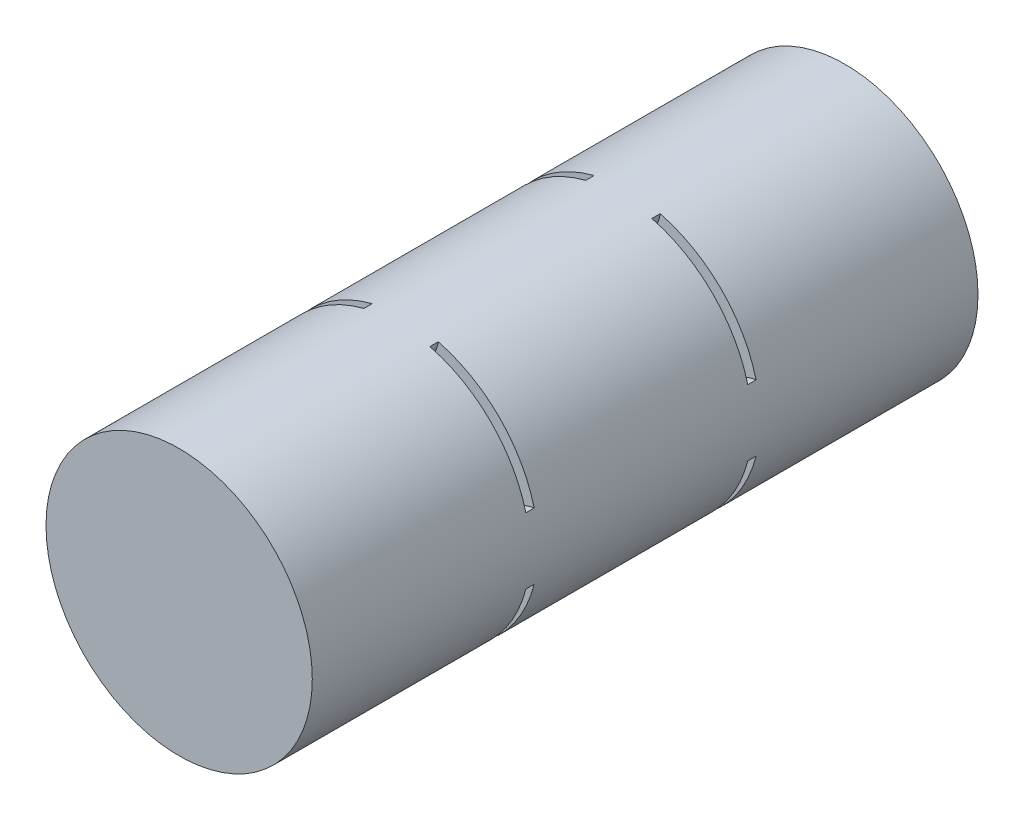
ISO-10303-21;
HEADER;
FILE_DESCRIPTION(('STEP AP214'),'2;1');
FILE_NAME('part.step','',(''),(''),'','','');
FILE_SCHEMA(('AUTOMOTIVE_DESIGN { 1 0 10303 214 1 1 1 1 }'));
ENDSEC;
DATA;
#1=APPLICATION_CONTEXT('core data for automotive mechanical design processes');
#2=APPLICATION_PROTOCOL_DEFINITION('international standard','automotive_design',2000,#1);
#3=PRODUCT_CONTEXT('',#1,'mechanical');
#4=PRODUCT('Part','Part','',(#3));
#5=PRODUCT_RELATED_PRODUCT_CATEGORY('part','',(#4));
#6=PRODUCT_DEFINITION_FORMATION('','',#4);
#7=PRODUCT_DEFINITION_CONTEXT('part definition',#1,'design');
#8=PRODUCT_DEFINITION('design','',#6,#7);
#9=PRODUCT_DEFINITION_SHAPE('','',#8);
#10=(LENGTH_UNIT() NAMED_UNIT(*) SI_UNIT(.MILLI.,.METRE.));
#11=(NAMED_UNIT(*) PLANE_ANGLE_UNIT() SI_UNIT($,.RADIAN.));
#12=(NAMED_UNIT(*) SI_UNIT($,.STERADIAN.) SOLID_ANGLE_UNIT());
#13=UNCERTAINTY_MEASURE_WITH_UNIT(LENGTH_MEASURE(1.E-05),#10,'distance_accuracy_value','');
#14=(GEOMETRIC_REPRESENTATION_CONTEXT(3) GLOBAL_UNCERTAINTY_ASSIGNED_CONTEXT((#13)) GLOBAL_UNIT_ASSIGNED_CONTEXT((#10,
#11,#12)) REPRESENTATION_CONTEXT('',''));
#15=CARTESIAN_POINT('',(0.,0.,0.));
#16=DIRECTION('',(0.,0.,1.));
#17=DIRECTION('',(1.,0.,0.));
#18=AXIS2_PLACEMENT_3D('',#15,#16,#17);
#19=CARTESIAN_POINT('',(0.,0.,254.));
#20=DIRECTION('',(0.,0.,-1.));
#21=DIRECTION('',(-1.,0.,0.));
#22=AXIS2_PLACEMENT_3D('',#19,#20,#21);
#23=CYLINDRICAL_SURFACE('',#22,50.8);
#24=DIRECTION('',(0.,0.,-1.));
#25=VECTOR('',#24,1.);
#26=CARTESIAN_POINT('',(-49.2125000000001,-12.6003906189445,86.25332));
#27=LINE('',#26,#25);
#28=CARTESIAN_POINT('',(-49.2125000000001,-12.6003906189445,86.25332));
#29=VERTEX_POINT('',#28);
#30=CARTESIAN_POINT('',(-49.2125000000001,-12.6003906189445,83.07832));
#31=VERTEX_POINT('',#30);
#32=EDGE_CURVE('E191',#29,#31,#27,.T.);
#33=ORIENTED_EDGE('',*,*,#32,.F.);
#34=CARTESIAN_POINT('',(0.,0.,86.25332));
#35=DIRECTION('',(0.,0.,1.));
#36=DIRECTION('',(1.,0.,0.));
#37=AXIS2_PLACEMENT_3D('',#34,#35,#36);
#38=CIRCLE('',#37,50.8);
#39=CARTESIAN_POINT('',(-12.6003906189444,-49.2125000000002,86.25332));
#40=VERTEX_POINT('',#39);
#41=EDGE_CURVE('E405',#29,#40,#38,.T.);
#42=ORIENTED_EDGE('',*,*,#41,.T.);
#43=DIRECTION('',(0.,0.,-1.));
#44=VECTOR('',#43,1.);
#45=CARTESIAN_POINT('',(-12.6003906189444,-49.2125000000002,86.25332));
#46=LINE('',#45,#44);
#47=CARTESIAN_POINT('',(-12.6003906189444,-49.2125000000002,83.07832));
#48=VERTEX_POINT('',#47);
#49=EDGE_CURVE('E362',#40,#48,#46,.T.);
#50=ORIENTED_EDGE('',*,*,#49,.T.);
#51=CARTESIAN_POINT('',(0.,0.,83.07832));
#52=DIRECTION('',(0.,0.,1.));
#53=DIRECTION('',(1.,0.,0.));
#54=AXIS2_PLACEMENT_3D('',#51,#52,#53);
#55=CIRCLE('',#54,50.8);
#56=EDGE_CURVE('E367',#31,#48,#55,.T.);
#57=ORIENTED_EDGE('',*,*,#56,.F.);
#58=EDGE_LOOP('',(#33,#42,#50,#57));
#59=FACE_BOUND('',#58,.T.);
#60=DIRECTION('',(0.,0.,-1.));
#61=VECTOR('',#60,1.);
#62=CARTESIAN_POINT('',(12.6003906189441,49.2125000000003,86.25332));
#63=LINE('',#62,#61);
#64=CARTESIAN_POINT('',(12.6003906189441,49.2125000000003,86.25332));
#65=VERTEX_POINT('',#64);
#66=CARTESIAN_POINT('',(12.6003906189441,49.2125000000003,83.07832));
#67=VERTEX_POINT('',#66);
#68=EDGE_CURVE('E176',#65,#67,#63,.T.);
#69=ORIENTED_EDGE('',*,*,#68,.T.);
#70=CARTESIAN_POINT('',(0.,0.,83.07832));
#71=DIRECTION('',(0.,0.,1.));
#72=DIRECTION('',(1.,0.,0.));
#73=AXIS2_PLACEMENT_3D('',#70,#71,#72);
#74=CIRCLE('',#73,50.8);
#75=CARTESIAN_POINT('',(49.2125000000001,12.6003906189448,83.07832));
#76=VERTEX_POINT('',#75);
#77=EDGE_CURVE('E178',#76,#67,#74,.T.);
#78=ORIENTED_EDGE('',*,*,#77,.F.);
#79=DIRECTION('',(0.,0.,-1.));
#80=VECTOR('',#79,1.);
#81=CARTESIAN_POINT('',(49.2125000000001,12.6003906189448,86.25332));
#82=LINE('',#81,#80);
#83=CARTESIAN_POINT('',(49.2125000000001,12.6003906189448,86.25332));
#84=VERTEX_POINT('',#83);
#85=EDGE_CURVE('E344',#84,#76,#82,.T.);
#86=ORIENTED_EDGE('',*,*,#85,.F.);
#87=CARTESIAN_POINT('',(0.,0.,86.25332));
#88=DIRECTION('',(0.,0.,1.));
#89=DIRECTION('',(1.,0.,0.));
#90=AXIS2_PLACEMENT_3D('',#87,#88,#89);
#91=CIRCLE('',#90,50.8);
#92=EDGE_CURVE('E342',#84,#65,#91,.T.);
#93=ORIENTED_EDGE('',*,*,#92,.T.);
#94=EDGE_LOOP('',(#69,#78,#86,#93));
#95=FACE_BOUND('',#94,.T.);
#96=DIRECTION('',(0.,0.,1.));
#97=VECTOR('',#96,1.);
#98=CARTESIAN_POINT('',(-49.2125000000003,12.6003906189439,167.74668));
#99=LINE('',#98,#97);
#100=CARTESIAN_POINT('',(-49.2125000000003,12.6003906189439,167.74668));
#101=VERTEX_POINT('',#100);
#102=CARTESIAN_POINT('',(-49.2125000000003,12.6003906189439,170.92168));
#103=VERTEX_POINT('',#102);
#104=EDGE_CURVE('E286',#101,#103,#99,.T.);
#105=ORIENTED_EDGE('',*,*,#104,.F.);
#106=CARTESIAN_POINT('',(0.,0.,167.74668));
#107=DIRECTION('',(0.,0.,1.));
#108=DIRECTION('',(1.,0.,0.));
#109=AXIS2_PLACEMENT_3D('',#106,#107,#108);
#110=CIRCLE('',#109,50.8);
#111=CARTESIAN_POINT('',(-12.6003906189451,49.2125,167.74668));
#112=VERTEX_POINT('',#111);
#113=EDGE_CURVE('E203',#112,#101,#110,.T.);
#114=ORIENTED_EDGE('',*,*,#113,.F.);
#115=DIRECTION('',(0.,0.,1.));
#116=VECTOR('',#115,1.);
#117=CARTESIAN_POINT('',(-12.6003906189451,49.2125,167.74668));
#118=LINE('',#117,#116);
#119=CARTESIAN_POINT('',(-12.6003906189451,49.2125,170.92168));
#120=VERTEX_POINT('',#119);
#121=EDGE_CURVE('E232',#112,#120,#118,.T.);
#122=ORIENTED_EDGE('',*,*,#121,.T.);
#123=CARTESIAN_POINT('',(0.,0.,170.92168));
#124=DIRECTION('',(0.,0.,1.));
#125=DIRECTION('',(1.,0.,0.));
#126=AXIS2_PLACEMENT_3D('',#123,#124,#125);
#127=CIRCLE('',#126,50.8);
#128=EDGE_CURVE('E236',#120,#103,#127,.T.);
#129=ORIENTED_EDGE('',*,*,#128,.T.);
#130=EDGE_LOOP('',(#105,#114,#122,#129));
#131=FACE_BOUND('',#130,.T.);
#132=DIRECTION('',(0.,0.,1.));
#133=VECTOR('',#132,1.);
#134=CARTESIAN_POINT('',(12.6003906189441,49.2125000000003,167.74668));
#135=LINE('',#134,#133);
#136=CARTESIAN_POINT('',(12.6003906189441,49.2125000000003,167.74668));
#137=VERTEX_POINT('',#136);
#138=CARTESIAN_POINT('',(12.6003906189444,49.2125000000002,170.92168));
#139=VERTEX_POINT('',#138);
#140=EDGE_CURVE('E262',#137,#139,#135,.T.);
#141=ORIENTED_EDGE('',*,*,#140,.F.);
#142=CARTESIAN_POINT('',(0.,0.,167.74668));
#143=DIRECTION('',(0.,0.,1.));
#144=DIRECTION('',(1.,0.,0.));
#145=AXIS2_PLACEMENT_3D('',#142,#143,#144);
#146=CIRCLE('',#145,50.8);
#147=CARTESIAN_POINT('',(49.2125000000001,12.6003906189448,167.74668));
#148=VERTEX_POINT('',#147);
#149=EDGE_CURVE('E228',#148,#137,#146,.T.);
#150=ORIENTED_EDGE('',*,*,#149,.F.);
#151=DIRECTION('',(0.,0.,1.));
#152=VECTOR('',#151,1.);
#153=CARTESIAN_POINT('',(49.2125000000001,12.6003906189448,167.74668));
#154=LINE('',#153,#152);
#155=CARTESIAN_POINT('',(49.2125000000001,12.6003906189448,170.92168));
#156=VERTEX_POINT('',#155);
#157=EDGE_CURVE('E266',#148,#156,#154,.T.);
#158=ORIENTED_EDGE('',*,*,#157,.T.);
#159=CARTESIAN_POINT('',(0.,0.,170.92168));
#160=DIRECTION('',(0.,0.,1.));
#161=DIRECTION('',(1.,0.,0.));
#162=AXIS2_PLACEMENT_3D('',#159,#160,#161);
#163=CIRCLE('',#162,50.8);
#164=EDGE_CURVE('E204',#156,#139,#163,.T.);
#165=ORIENTED_EDGE('',*,*,#164,.T.);
#166=EDGE_LOOP('',(#141,#150,#158,#165));
#167=FACE_BOUND('',#166,.T.);
#168=DIRECTION('',(0.,0.,1.));
#169=VECTOR('',#168,1.);
#170=CARTESIAN_POINT('',(49.2125000000002,-12.6003906189443,167.74668));
#171=LINE('',#170,#169);
#172=CARTESIAN_POINT('',(49.2125000000002,-12.6003906189443,167.74668));
#173=VERTEX_POINT('',#172);
#174=CARTESIAN_POINT('',(49.2125000000002,-12.6003906189443,170.92168));
#175=VERTEX_POINT('',#174);
#176=EDGE_CURVE('E270',#173,#175,#171,.T.);
#177=ORIENTED_EDGE('',*,*,#176,.F.);
#178=CARTESIAN_POINT('',(0.,0.,167.74668));
#179=DIRECTION('',(0.,0.,1.));
#180=DIRECTION('',(1.,0.,0.));
#181=AXIS2_PLACEMENT_3D('',#178,#179,#180);
#182=CIRCLE('',#181,50.8);
#183=CARTESIAN_POINT('',(12.6003906189448,-49.2125000000001,167.74668));
#184=VERTEX_POINT('',#183);
#185=EDGE_CURVE('E220',#184,#173,#182,.T.);
#186=ORIENTED_EDGE('',*,*,#185,.F.);
#187=DIRECTION('',(0.,0.,1.));
#188=VECTOR('',#187,1.);
#189=CARTESIAN_POINT('',(12.6003906189448,-49.2125000000001,167.74668));
#190=LINE('',#189,#188);
#191=CARTESIAN_POINT('',(12.6003906189448,-49.2125000000001,170.92168));
#192=VERTEX_POINT('',#191);
#193=EDGE_CURVE('E274',#184,#192,#190,.T.);
#194=ORIENTED_EDGE('',*,*,#193,.T.);
#195=CARTESIAN_POINT('',(0.,0.,170.92168));
#196=DIRECTION('',(0.,0.,1.));
#197=DIRECTION('',(1.,0.,0.));
#198=AXIS2_PLACEMENT_3D('',#195,#196,#197);
#199=CIRCLE('',#198,50.8);
#200=EDGE_CURVE('E252',#192,#175,#199,.T.);
#201=ORIENTED_EDGE('',*,*,#200,.T.);
#202=EDGE_LOOP('',(#177,#186,#194,#201));
#203=FACE_BOUND('',#202,.T.);
#204=DIRECTION('',(0.,0.,1.));
#205=VECTOR('',#204,1.);
#206=CARTESIAN_POINT('',(-12.6003906189444,-49.2125000000002,167.74668));
#207=LINE('',#206,#205);
#208=CARTESIAN_POINT('',(-12.6003906189444,-49.2125000000002,167.74668));
#209=VERTEX_POINT('',#208);
#210=CARTESIAN_POINT('',(-12.6003906189444,-49.2125000000002,170.92168));
#211=VERTEX_POINT('',#210);
#212=EDGE_CURVE('E278',#209,#211,#207,.T.);
#213=ORIENTED_EDGE('',*,*,#212,.F.);
#214=CARTESIAN_POINT('',(0.,0.,167.74668));
#215=DIRECTION('',(0.,0.,1.));
#216=DIRECTION('',(1.,0.,0.));
#217=AXIS2_PLACEMENT_3D('',#214,#215,#216);
#218=CIRCLE('',#217,50.8);
#219=CARTESIAN_POINT('',(-49.2125000000001,-12.6003906189445,167.74668));
#220=VERTEX_POINT('',#219);
#221=EDGE_CURVE('E212',#220,#209,#218,.T.);
#222=ORIENTED_EDGE('',*,*,#221,.F.);
#223=DIRECTION('',(0.,0.,1.));
#224=VECTOR('',#223,1.);
#225=CARTESIAN_POINT('',(-49.2125000000001,-12.6003906189445,167.74668));
#226=LINE('',#225,#224);
#227=CARTESIAN_POINT('',(-49.2125000000001,-12.6003906189445,170.92168));
#228=VERTEX_POINT('',#227);
#229=EDGE_CURVE('E282',#220,#228,#226,.T.);
#230=ORIENTED_EDGE('',*,*,#229,.T.);
#231=CARTESIAN_POINT('',(0.,0.,170.92168));
#232=DIRECTION('',(0.,0.,1.));
#233=DIRECTION('',(1.,0.,0.));
#234=AXIS2_PLACEMENT_3D('',#231,#232,#233);
#235=CIRCLE('',#234,50.8);
#236=EDGE_CURVE('E244',#228,#211,#235,.T.);
#237=ORIENTED_EDGE('',*,*,#236,.T.);
#238=EDGE_LOOP('',(#213,#222,#230,#237));
#239=FACE_BOUND('',#238,.T.);
#240=CARTESIAN_POINT('',(0.,0.,254.));
#241=DIRECTION('',(0.,0.,1.));
#242=DIRECTION('',(1.,0.,0.));
#243=AXIS2_PLACEMENT_3D('',#240,#241,#242);
#244=CIRCLE('',#243,50.8);
#245=CARTESIAN_POINT('',(50.8,0.,254.));
#246=VERTEX_POINT('',#245);
#247=EDGE_CURVE('E11',#246,#246,#244,.T.);
#248=ORIENTED_EDGE('',*,*,#247,.F.);
#249=EDGE_LOOP('',(#248));
#250=FACE_BOUND('',#249,.T.);
#251=CARTESIAN_POINT('',(0.,0.,0.));
#252=DIRECTION('',(0.,0.,1.));
#253=DIRECTION('',(1.,0.,0.));
#254=AXIS2_PLACEMENT_3D('',#251,#252,#253);
#255=CIRCLE('',#254,50.8);
#256=CARTESIAN_POINT('',(50.8,0.,0.));
#257=VERTEX_POINT('',#256);
#258=EDGE_CURVE('E46',#257,#257,#255,.T.);
#259=ORIENTED_EDGE('',*,*,#258,.T.);
#260=EDGE_LOOP('',(#259));
#261=FACE_BOUND('',#260,.T.);
#262=DIRECTION('',(0.,0.,-1.));
#263=VECTOR('',#262,1.);
#264=CARTESIAN_POINT('',(12.6003906189448,-49.2125000000001,86.25332));
#265=LINE('',#264,#263);
#266=CARTESIAN_POINT('',(12.6003906189448,-49.2125000000001,86.25332));
#267=VERTEX_POINT('',#266);
#268=CARTESIAN_POINT('',(12.6003906189448,-49.2125000000001,83.07832));
#269=VERTEX_POINT('',#268);
#270=EDGE_CURVE('E359',#267,#269,#265,.T.);
#271=ORIENTED_EDGE('',*,*,#270,.F.);
#272=CARTESIAN_POINT('',(0.,0.,86.25332));
#273=DIRECTION('',(0.,0.,1.));
#274=DIRECTION('',(1.,0.,0.));
#275=AXIS2_PLACEMENT_3D('',#272,#273,#274);
#276=CIRCLE('',#275,50.8);
#277=CARTESIAN_POINT('',(49.2125000000002,-12.6003906189443,86.25332));
#278=VERTEX_POINT('',#277);
#279=EDGE_CURVE('E398',#267,#278,#276,.T.);
#280=ORIENTED_EDGE('',*,*,#279,.T.);
#281=DIRECTION('',(0.,0.,-1.));
#282=VECTOR('',#281,1.);
#283=CARTESIAN_POINT('',(49.2125000000002,-12.6003906189443,86.25332));
#284=LINE('',#283,#282);
#285=CARTESIAN_POINT('',(49.2125000000002,-12.6003906189444,83.07832));
#286=VERTEX_POINT('',#285);
#287=EDGE_CURVE('E349',#278,#286,#284,.T.);
#288=ORIENTED_EDGE('',*,*,#287,.T.);
#289=CARTESIAN_POINT('',(0.,0.,83.07832));
#290=DIRECTION('',(0.,0.,1.));
#291=DIRECTION('',(1.,0.,0.));
#292=AXIS2_PLACEMENT_3D('',#289,#290,#291);
#293=CIRCLE('',#292,50.8);
#294=EDGE_CURVE('E373',#269,#286,#293,.T.);
#295=ORIENTED_EDGE('',*,*,#294,.F.);
#296=EDGE_LOOP('',(#271,#280,#288,#295));
#297=FACE_BOUND('',#296,.T.);
#298=DIRECTION('',(0.,0.,-1.));
#299=VECTOR('',#298,1.);
#300=CARTESIAN_POINT('',(-12.6003906189451,49.2125,86.25332));
#301=LINE('',#300,#299);
#302=CARTESIAN_POINT('',(-12.6003906189451,49.2125,86.25332));
#303=VERTEX_POINT('',#302);
#304=CARTESIAN_POINT('',(-12.6003906189451,49.2125,83.07832));
#305=VERTEX_POINT('',#304);
#306=EDGE_CURVE('E173',#303,#305,#301,.T.);
#307=ORIENTED_EDGE('',*,*,#306,.F.);
#308=CARTESIAN_POINT('',(0.,0.,86.25332));
#309=DIRECTION('',(0.,0.,1.));
#310=DIRECTION('',(1.,0.,0.));
#311=AXIS2_PLACEMENT_3D('',#308,#309,#310);
#312=CIRCLE('',#311,50.8);
#313=CARTESIAN_POINT('',(-49.2125000000003,12.6003906189439,86.25332));
#314=VERTEX_POINT('',#313);
#315=EDGE_CURVE('E157',#303,#314,#312,.T.);
#316=ORIENTED_EDGE('',*,*,#315,.T.);
#317=DIRECTION('',(0.,0.,-1.));
#318=VECTOR('',#317,1.);
#319=CARTESIAN_POINT('',(-49.2125000000003,12.6003906189439,86.25332));
#320=LINE('',#319,#318);
#321=CARTESIAN_POINT('',(-49.2125000000002,12.6003906189442,83.07832));
#322=VERTEX_POINT('',#321);
#323=EDGE_CURVE('E184',#314,#322,#320,.T.);
#324=ORIENTED_EDGE('',*,*,#323,.T.);
#325=CARTESIAN_POINT('',(0.,0.,83.07832));
#326=DIRECTION('',(0.,0.,1.));
#327=DIRECTION('',(1.,0.,0.));
#328=AXIS2_PLACEMENT_3D('',#325,#326,#327);
#329=CIRCLE('',#328,50.8);
#330=EDGE_CURVE('E181',#305,#322,#329,.T.);
#331=ORIENTED_EDGE('',*,*,#330,.F.);
#332=EDGE_LOOP('',(#307,#316,#324,#331));
#333=FACE_BOUND('',#332,.T.);
#334=ADVANCED_FACE('F43',(#59,#95,#131,#167,#203,#239,#250,#261,#297,#333),#23,.T.);
#335=CARTESIAN_POINT('',(0.,0.,254.));
#336=DIRECTION('',(0.,0.,1.));
#337=DIRECTION('',(1.,0.,0.));
#338=AXIS2_PLACEMENT_3D('',#335,#336,#337);
#339=PLANE('',#338);
#340=ORIENTED_EDGE('',*,*,#247,.T.);
#341=EDGE_LOOP('',(#340));
#342=FACE_BOUND('',#341,.T.);
#343=ADVANCED_FACE('F329',(#342),#339,.T.);
#344=CARTESIAN_POINT('',(0.,0.,0.));
#345=DIRECTION('',(0.,0.,1.));
#346=DIRECTION('',(1.,0.,0.));
#347=AXIS2_PLACEMENT_3D('',#344,#345,#346);
#348=PLANE('',#347);
#349=ORIENTED_EDGE('',*,*,#258,.F.);
#350=EDGE_LOOP('',(#349));
#351=FACE_BOUND('',#350,.T.);
#352=ADVANCED_FACE('F325',(#351),#348,.F.);
#353=CARTESIAN_POINT('',(-1.75763585778158E-13,50.8000000000042,167.74668));
#354=DIRECTION('',(0.,0.,1.));
#355=DIRECTION('',(1.,0.,0.));
#356=AXIS2_PLACEMENT_3D('',#353,#354,#355);
#357=CYLINDRICAL_SURFACE('',#356,12.7);
#358=CARTESIAN_POINT('',(-1.75763585778158E-13,50.8000000000042,170.92168));
#359=DIRECTION('',(0.,0.,-1.));
#360=DIRECTION('',(-1.,0.,0.));
#361=AXIS2_PLACEMENT_3D('',#358,#359,#360);
#362=CIRCLE('',#361,12.7);
#363=EDGE_CURVE('E197',#139,#120,#362,.T.);
#364=ORIENTED_EDGE('',*,*,#363,.T.);
#365=ORIENTED_EDGE('',*,*,#121,.F.);
#366=CARTESIAN_POINT('',(-1.75763585778158E-13,50.8000000000042,167.74668));
#367=DIRECTION('',(0.,0.,-1.));
#368=DIRECTION('',(-1.,0.,0.));
#369=AXIS2_PLACEMENT_3D('',#366,#367,#368);
#370=CIRCLE('',#369,12.7);
#371=EDGE_CURVE('E199',#137,#112,#370,.T.);
#372=ORIENTED_EDGE('',*,*,#371,.F.);
#373=ORIENTED_EDGE('',*,*,#140,.T.);
#374=EDGE_LOOP('',(#364,#365,#372,#373));
#375=FACE_BOUND('',#374,.T.);
#376=ADVANCED_FACE('F297',(#375),#357,.T.);
#377=CARTESIAN_POINT('',(50.8000000000042,1.78874188647992E-13,167.74668));
#378=DIRECTION('',(0.,0.,1.));
#379=DIRECTION('',(1.,0.,0.));
#380=AXIS2_PLACEMENT_3D('',#377,#378,#379);
#381=CYLINDRICAL_SURFACE('',#380,12.7);
#382=CARTESIAN_POINT('',(50.8000000000042,1.78874188647992E-13,170.92168));
#383=DIRECTION('',(0.,0.,-1.));
#384=DIRECTION('',(-1.,0.,0.));
#385=AXIS2_PLACEMENT_3D('',#382,#383,#384);
#386=CIRCLE('',#385,12.7);
#387=EDGE_CURVE('E256',#175,#156,#386,.T.);
#388=ORIENTED_EDGE('',*,*,#387,.T.);
#389=ORIENTED_EDGE('',*,*,#157,.F.);
#390=CARTESIAN_POINT('',(50.8000000000042,1.78874188647992E-13,167.74668));
#391=DIRECTION('',(0.,0.,-1.));
#392=DIRECTION('',(-1.,0.,0.));
#393=AXIS2_PLACEMENT_3D('',#390,#391,#392);
#394=CIRCLE('',#393,12.7);
#395=EDGE_CURVE('E224',#173,#148,#394,.T.);
#396=ORIENTED_EDGE('',*,*,#395,.F.);
#397=ORIENTED_EDGE('',*,*,#176,.T.);
#398=EDGE_LOOP('',(#388,#389,#396,#397));
#399=FACE_BOUND('',#398,.T.);
#400=ADVANCED_FACE('F317',(#399),#381,.T.);
#401=CARTESIAN_POINT('',(1.81984791517827E-13,-50.8000000000042,167.74668));
#402=DIRECTION('',(0.,0.,1.));
#403=DIRECTION('',(1.,0.,0.));
#404=AXIS2_PLACEMENT_3D('',#401,#402,#403);
#405=CYLINDRICAL_SURFACE('',#404,12.7);
#406=CARTESIAN_POINT('',(1.81984791517827E-13,-50.8000000000042,170.92168));
#407=DIRECTION('',(0.,0.,-1.));
#408=DIRECTION('',(-1.,0.,0.));
#409=AXIS2_PLACEMENT_3D('',#406,#407,#408);
#410=CIRCLE('',#409,12.7);
#411=EDGE_CURVE('E248',#211,#192,#410,.T.);
#412=ORIENTED_EDGE('',*,*,#411,.T.);
#413=ORIENTED_EDGE('',*,*,#193,.F.);
#414=CARTESIAN_POINT('',(1.81984791517827E-13,-50.8000000000042,167.74668));
#415=DIRECTION('',(0.,0.,-1.));
#416=DIRECTION('',(-1.,0.,0.));
#417=AXIS2_PLACEMENT_3D('',#414,#415,#416);
#418=CIRCLE('',#417,12.7);
#419=EDGE_CURVE('E216',#209,#184,#418,.T.);
#420=ORIENTED_EDGE('',*,*,#419,.F.);
#421=ORIENTED_EDGE('',*,*,#212,.T.);
#422=EDGE_LOOP('',(#412,#413,#420,#421));
#423=FACE_BOUND('',#422,.T.);
#424=ADVANCED_FACE('F313',(#423),#405,.T.);
#425=CARTESIAN_POINT('',(-50.8000000000042,-1.72652982908323E-13,167.74668));
#426=DIRECTION('',(0.,0.,1.));
#427=DIRECTION('',(1.,0.,0.));
#428=AXIS2_PLACEMENT_3D('',#425,#426,#427);
#429=CYLINDRICAL_SURFACE('',#428,12.6999999999997);
#430=CARTESIAN_POINT('',(-50.8000000000042,-1.72652982908323E-13,170.92168));
#431=DIRECTION('',(0.,0.,-1.));
#432=DIRECTION('',(-1.,0.,0.));
#433=AXIS2_PLACEMENT_3D('',#430,#431,#432);
#434=CIRCLE('',#433,12.6999999999997);
#435=EDGE_CURVE('E240',#103,#228,#434,.T.);
#436=ORIENTED_EDGE('',*,*,#435,.T.);
#437=ORIENTED_EDGE('',*,*,#229,.F.);
#438=CARTESIAN_POINT('',(-50.8000000000042,-1.72652982908323E-13,167.74668));
#439=DIRECTION('',(0.,0.,-1.));
#440=DIRECTION('',(-1.,0.,0.));
#441=AXIS2_PLACEMENT_3D('',#438,#439,#440);
#442=CIRCLE('',#441,12.6999999999997);
#443=EDGE_CURVE('E208',#101,#220,#442,.T.);
#444=ORIENTED_EDGE('',*,*,#443,.F.);
#445=ORIENTED_EDGE('',*,*,#104,.T.);
#446=EDGE_LOOP('',(#436,#437,#444,#445));
#447=FACE_BOUND('',#446,.T.);
#448=ADVANCED_FACE('F307',(#447),#429,.T.);
#449=CARTESIAN_POINT('',(0.,25.4000000000021,167.74668));
#450=DIRECTION('',(0.,0.,-1.));
#451=DIRECTION('',(-1.,0.,0.));
#452=AXIS2_PLACEMENT_3D('',#449,#450,#451);
#453=PLANE('',#452);
#454=CARTESIAN_POINT('',(0.,0.,167.74668));
#455=DIRECTION('',(0.,0.,1.));
#456=DIRECTION('',(1.,0.,0.));
#457=AXIS2_PLACEMENT_3D('',#454,#455,#456);
#458=CIRCLE('',#457,19.05);
#459=CARTESIAN_POINT('',(19.05,0.,167.74668));
#460=VERTEX_POINT('',#459);
#461=EDGE_CURVE('E189',#460,#460,#458,.T.);
#462=ORIENTED_EDGE('',*,*,#461,.F.);
#463=EDGE_LOOP('',(#462));
#464=FACE_BOUND('',#463,.T.);
#465=ORIENTED_EDGE('',*,*,#371,.T.);
#466=ORIENTED_EDGE('',*,*,#113,.T.);
#467=ORIENTED_EDGE('',*,*,#443,.T.);
#468=ORIENTED_EDGE('',*,*,#221,.T.);
#469=ORIENTED_EDGE('',*,*,#419,.T.);
#470=ORIENTED_EDGE('',*,*,#185,.T.);
#471=ORIENTED_EDGE('',*,*,#395,.T.);
#472=ORIENTED_EDGE('',*,*,#149,.T.);
#473=EDGE_LOOP('',(#465,#466,#467,#468,#469,#470,#471,#472));
#474=FACE_BOUND('',#473,.T.);
#475=ADVANCED_FACE('F299',(#464,#474),#453,.F.);
#476=CARTESIAN_POINT('',(0.,25.4000000000021,170.92168));
#477=DIRECTION('',(0.,0.,-1.));
#478=DIRECTION('',(-1.,0.,0.));
#479=AXIS2_PLACEMENT_3D('',#476,#477,#478);
#480=PLANE('',#479);
#481=CARTESIAN_POINT('',(0.,0.,170.92168));
#482=DIRECTION('',(0.,0.,1.));
#483=DIRECTION('',(1.,0.,0.));
#484=AXIS2_PLACEMENT_3D('',#481,#482,#483);
#485=CIRCLE('',#484,19.05);
#486=CARTESIAN_POINT('',(19.05,0.,170.92168));
#487=VERTEX_POINT('',#486);
#488=EDGE_CURVE('E183',#487,#487,#485,.T.);
#489=ORIENTED_EDGE('',*,*,#488,.T.);
#490=EDGE_LOOP('',(#489));
#491=FACE_BOUND('',#490,.T.);
#492=ORIENTED_EDGE('',*,*,#363,.F.);
#493=ORIENTED_EDGE('',*,*,#164,.F.);
#494=ORIENTED_EDGE('',*,*,#387,.F.);
#495=ORIENTED_EDGE('',*,*,#200,.F.);
#496=ORIENTED_EDGE('',*,*,#411,.F.);
#497=ORIENTED_EDGE('',*,*,#236,.F.);
#498=ORIENTED_EDGE('',*,*,#435,.F.);
#499=ORIENTED_EDGE('',*,*,#128,.F.);
#500=EDGE_LOOP('',(#492,#493,#494,#495,#496,#497,#498,#499));
#501=FACE_BOUND('',#500,.T.);
#502=ADVANCED_FACE('F305',(#491,#501),#480,.T.);
#503=CARTESIAN_POINT('',(0.,0.,167.74668));
#504=DIRECTION('',(0.,0.,1.));
#505=DIRECTION('',(1.,0.,0.));
#506=AXIS2_PLACEMENT_3D('',#503,#504,#505);
#507=CYLINDRICAL_SURFACE('',#506,19.05);
#508=ORIENTED_EDGE('',*,*,#461,.T.);
#509=EDGE_LOOP('',(#508));
#510=FACE_BOUND('',#509,.T.);
#511=ORIENTED_EDGE('',*,*,#488,.F.);
#512=EDGE_LOOP('',(#511));
#513=FACE_BOUND('',#512,.T.);
#514=ADVANCED_FACE('F422',(#510,#513),#507,.T.);
#515=CARTESIAN_POINT('',(0.,25.4000000000021,86.25332));
#516=DIRECTION('',(0.,0.,-1.));
#517=DIRECTION('',(-1.,0.,0.));
#518=AXIS2_PLACEMENT_3D('',#515,#516,#517);
#519=PLANE('',#518);
#520=CARTESIAN_POINT('',(-1.75763585778158E-13,50.8000000000042,86.25332));
#521=DIRECTION('',(0.,0.,-1.));
#522=DIRECTION('',(-1.,0.,0.));
#523=AXIS2_PLACEMENT_3D('',#520,#521,#522);
#524=CIRCLE('',#523,12.7);
#525=EDGE_CURVE('E161',#65,#303,#524,.T.);
#526=ORIENTED_EDGE('',*,*,#525,.F.);
#527=ORIENTED_EDGE('',*,*,#92,.F.);
#528=CARTESIAN_POINT('',(50.8000000000042,1.78874188647992E-13,86.25332));
#529=DIRECTION('',(0.,0.,-1.));
#530=DIRECTION('',(-1.,0.,0.));
#531=AXIS2_PLACEMENT_3D('',#528,#529,#530);
#532=CIRCLE('',#531,12.7);
#533=EDGE_CURVE('E351',#278,#84,#532,.T.);
#534=ORIENTED_EDGE('',*,*,#533,.F.);
#535=ORIENTED_EDGE('',*,*,#279,.F.);
#536=CARTESIAN_POINT('',(1.81984791517827E-13,-50.8000000000042,86.25332));
#537=DIRECTION('',(0.,0.,-1.));
#538=DIRECTION('',(-1.,0.,0.));
#539=AXIS2_PLACEMENT_3D('',#536,#537,#538);
#540=CIRCLE('',#539,12.7);
#541=EDGE_CURVE('E402',#40,#267,#540,.T.);
#542=ORIENTED_EDGE('',*,*,#541,.F.);
#543=ORIENTED_EDGE('',*,*,#41,.F.);
#544=CARTESIAN_POINT('',(-50.8000000000042,-1.72652982908323E-13,86.25332));
#545=DIRECTION('',(0.,0.,-1.));
#546=DIRECTION('',(-1.,0.,0.));
#547=AXIS2_PLACEMENT_3D('',#544,#545,#546);
#548=CIRCLE('',#547,12.6999999999997);
#549=EDGE_CURVE('E164',#314,#29,#548,.T.);
#550=ORIENTED_EDGE('',*,*,#549,.F.);
#551=ORIENTED_EDGE('',*,*,#315,.F.);
#552=EDGE_LOOP('',(#526,#527,#534,#535,#542,#543,#550,#551));
#553=FACE_BOUND('',#552,.T.);
#554=CARTESIAN_POINT('',(0.,0.,86.25332));
#555=DIRECTION('',(0.,0.,1.));
#556=DIRECTION('',(1.,0.,0.));
#557=AXIS2_PLACEMENT_3D('',#554,#555,#556);
#558=CIRCLE('',#557,19.05);
#559=CARTESIAN_POINT('',(19.05,0.,86.25332));
#560=VERTEX_POINT('',#559);
#561=EDGE_CURVE('E387',#560,#560,#558,.T.);
#562=ORIENTED_EDGE('',*,*,#561,.T.);
#563=EDGE_LOOP('',(#562));
#564=FACE_BOUND('',#563,.T.);
#565=ADVANCED_FACE('F159',(#553,#564),#519,.T.);
#566=CARTESIAN_POINT('',(0.,25.4000000000021,83.07832));
#567=DIRECTION('',(0.,0.,-1.));
#568=DIRECTION('',(-1.,0.,0.));
#569=AXIS2_PLACEMENT_3D('',#566,#567,#568);
#570=PLANE('',#569);
#571=CARTESIAN_POINT('',(-1.75763585778158E-13,50.8000000000042,83.07832));
#572=DIRECTION('',(0.,0.,-1.));
#573=DIRECTION('',(-1.,0.,0.));
#574=AXIS2_PLACEMENT_3D('',#571,#572,#573);
#575=CIRCLE('',#574,12.7);
#576=EDGE_CURVE('E385',#67,#305,#575,.T.);
#577=ORIENTED_EDGE('',*,*,#576,.T.);
#578=ORIENTED_EDGE('',*,*,#330,.T.);
#579=CARTESIAN_POINT('',(-50.8000000000042,-1.72652982908323E-13,83.07832));
#580=DIRECTION('',(0.,0.,-1.));
#581=DIRECTION('',(-1.,0.,0.));
#582=AXIS2_PLACEMENT_3D('',#579,#580,#581);
#583=CIRCLE('',#582,12.6999999999997);
#584=EDGE_CURVE('E58',#322,#31,#583,.T.);
#585=ORIENTED_EDGE('',*,*,#584,.T.);
#586=ORIENTED_EDGE('',*,*,#56,.T.);
#587=CARTESIAN_POINT('',(1.81984791517827E-13,-50.8000000000042,83.07832));
#588=DIRECTION('',(0.,0.,-1.));
#589=DIRECTION('',(-1.,0.,0.));
#590=AXIS2_PLACEMENT_3D('',#587,#588,#589);
#591=CIRCLE('',#590,12.7);
#592=EDGE_CURVE('E66',#48,#269,#591,.T.);
#593=ORIENTED_EDGE('',*,*,#592,.T.);
#594=ORIENTED_EDGE('',*,*,#294,.T.);
#595=CARTESIAN_POINT('',(50.8000000000042,1.78874188647992E-13,83.07832));
#596=DIRECTION('',(0.,0.,-1.));
#597=DIRECTION('',(-1.,0.,0.));
#598=AXIS2_PLACEMENT_3D('',#595,#596,#597);
#599=CIRCLE('',#598,12.7);
#600=EDGE_CURVE('E380',#286,#76,#599,.T.);
#601=ORIENTED_EDGE('',*,*,#600,.T.);
#602=ORIENTED_EDGE('',*,*,#77,.T.);
#603=EDGE_LOOP('',(#577,#578,#585,#586,#593,#594,#601,#602));
#604=FACE_BOUND('',#603,.T.);
#605=CARTESIAN_POINT('',(0.,0.,83.07832));
#606=DIRECTION('',(0.,0.,1.));
#607=DIRECTION('',(1.,0.,0.));
#608=AXIS2_PLACEMENT_3D('',#605,#606,#607);
#609=CIRCLE('',#608,19.05);
#610=CARTESIAN_POINT('',(19.05,0.,83.07832));
#611=VERTEX_POINT('',#610);
#612=EDGE_CURVE('E392',#611,#611,#609,.T.);
#613=ORIENTED_EDGE('',*,*,#612,.F.);
#614=EDGE_LOOP('',(#613));
#615=FACE_BOUND('',#614,.T.);
#616=ADVANCED_FACE('F383',(#604,#615),#570,.F.);
#617=CARTESIAN_POINT('',(-1.75763585778158E-13,50.8000000000042,86.25332));
#618=DIRECTION('',(0.,0.,-1.));
#619=DIRECTION('',(-1.,0.,0.));
#620=AXIS2_PLACEMENT_3D('',#617,#618,#619);
#621=CYLINDRICAL_SURFACE('',#620,12.7);
#622=ORIENTED_EDGE('',*,*,#576,.F.);
#623=ORIENTED_EDGE('',*,*,#68,.F.);
#624=ORIENTED_EDGE('',*,*,#525,.T.);
#625=ORIENTED_EDGE('',*,*,#306,.T.);
#626=EDGE_LOOP('',(#622,#623,#624,#625));
#627=FACE_BOUND('',#626,.T.);
#628=ADVANCED_FACE('F172',(#627),#621,.T.);
#629=CARTESIAN_POINT('',(-50.8000000000042,-1.72652982908323E-13,86.25332));
#630=DIRECTION('',(0.,0.,-1.));
#631=DIRECTION('',(-1.,0.,0.));
#632=AXIS2_PLACEMENT_3D('',#629,#630,#631);
#633=CYLINDRICAL_SURFACE('',#632,12.6999999999997);
#634=ORIENTED_EDGE('',*,*,#584,.F.);
#635=ORIENTED_EDGE('',*,*,#323,.F.);
#636=ORIENTED_EDGE('',*,*,#549,.T.);
#637=ORIENTED_EDGE('',*,*,#32,.T.);
#638=EDGE_LOOP('',(#634,#635,#636,#637));
#639=FACE_BOUND('',#638,.T.);
#640=ADVANCED_FACE('F366',(#639),#633,.T.);
#641=CARTESIAN_POINT('',(1.81984791517827E-13,-50.8000000000042,86.25332));
#642=DIRECTION('',(0.,0.,-1.));
#643=DIRECTION('',(-1.,0.,0.));
#644=AXIS2_PLACEMENT_3D('',#641,#642,#643);
#645=CYLINDRICAL_SURFACE('',#644,12.7);
#646=ORIENTED_EDGE('',*,*,#592,.F.);
#647=ORIENTED_EDGE('',*,*,#49,.F.);
#648=ORIENTED_EDGE('',*,*,#541,.T.);
#649=ORIENTED_EDGE('',*,*,#270,.T.);
#650=EDGE_LOOP('',(#646,#647,#648,#649));
#651=FACE_BOUND('',#650,.T.);
#652=ADVANCED_FACE('F429',(#651),#645,.T.);
#653=CARTESIAN_POINT('',(50.8000000000042,1.78874188647992E-13,86.25332));
#654=DIRECTION('',(0.,0.,-1.));
#655=DIRECTION('',(-1.,0.,0.));
#656=AXIS2_PLACEMENT_3D('',#653,#654,#655);
#657=CYLINDRICAL_SURFACE('',#656,12.7);
#658=ORIENTED_EDGE('',*,*,#600,.F.);
#659=ORIENTED_EDGE('',*,*,#287,.F.);
#660=ORIENTED_EDGE('',*,*,#533,.T.);
#661=ORIENTED_EDGE('',*,*,#85,.T.);
#662=EDGE_LOOP('',(#658,#659,#660,#661));
#663=FACE_BOUND('',#662,.T.);
#664=ADVANCED_FACE('F426',(#663),#657,.T.);
#665=CARTESIAN_POINT('',(0.,0.,86.25332));
#666=DIRECTION('',(0.,0.,-1.));
#667=DIRECTION('',(-1.,0.,0.));
#668=AXIS2_PLACEMENT_3D('',#665,#666,#667);
#669=CYLINDRICAL_SURFACE('',#668,19.05);
#670=ORIENTED_EDGE('',*,*,#561,.F.);
#671=EDGE_LOOP('',(#670));
#672=FACE_BOUND('',#671,.T.);
#673=ORIENTED_EDGE('',*,*,#612,.T.);
#674=EDGE_LOOP('',(#673));
#675=FACE_BOUND('',#674,.T.);
#676=ADVANCED_FACE('F414',(#672,#675),#669,.T.);
#677=CLOSED_SHELL('',(#334,#343,#352,#376,#400,#424,#448,#475,#502,#514,#565,#616,#628,#640,
#652,#664,#676));
#678=MANIFOLD_SOLID_BREP('B2',#677);
#679=ADVANCED_BREP_SHAPE_REPRESENTATION('',(#18,#678),#14);
#680=SHAPE_DEFINITION_REPRESENTATION(#9,#679);
ENDSEC;
END-ISO-10303-21;
